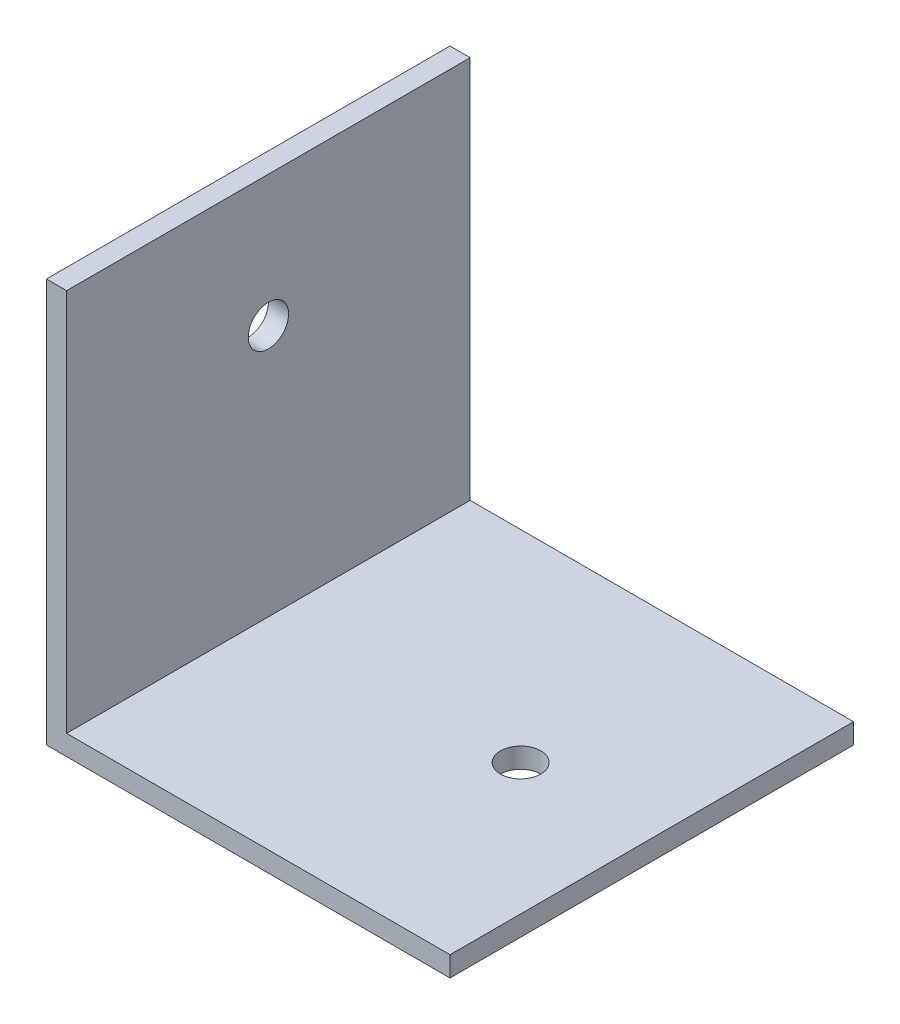
ISO-10303-21;
HEADER;
FILE_DESCRIPTION(('STEP AP214'),'2;1');
FILE_NAME('part.step','',(''),(''),'','','');
FILE_SCHEMA(('AUTOMOTIVE_DESIGN { 1 0 10303 214 1 1 1 1 }'));
ENDSEC;
DATA;
#1=APPLICATION_CONTEXT('core data for automotive mechanical design processes');
#2=APPLICATION_PROTOCOL_DEFINITION('international standard','automotive_design',2000,#1);
#3=PRODUCT_CONTEXT('',#1,'mechanical');
#4=PRODUCT('Part','Part','',(#3));
#5=PRODUCT_RELATED_PRODUCT_CATEGORY('part','',(#4));
#6=PRODUCT_DEFINITION_FORMATION('','',#4);
#7=PRODUCT_DEFINITION_CONTEXT('part definition',#1,'design');
#8=PRODUCT_DEFINITION('design','',#6,#7);
#9=PRODUCT_DEFINITION_SHAPE('','',#8);
#10=(LENGTH_UNIT() NAMED_UNIT(*) SI_UNIT(.MILLI.,.METRE.));
#11=(NAMED_UNIT(*) PLANE_ANGLE_UNIT() SI_UNIT($,.RADIAN.));
#12=(NAMED_UNIT(*) SI_UNIT($,.STERADIAN.) SOLID_ANGLE_UNIT());
#13=UNCERTAINTY_MEASURE_WITH_UNIT(LENGTH_MEASURE(1.E-05),#10,'distance_accuracy_value','');
#14=(GEOMETRIC_REPRESENTATION_CONTEXT(3) GLOBAL_UNCERTAINTY_ASSIGNED_CONTEXT((#13)) GLOBAL_UNIT_ASSIGNED_CONTEXT((#10,
#11,#12)) REPRESENTATION_CONTEXT('',''));
#15=CARTESIAN_POINT('',(0.,0.,0.));
#16=DIRECTION('',(0.,0.,1.));
#17=DIRECTION('',(1.,0.,0.));
#18=AXIS2_PLACEMENT_3D('',#15,#16,#17);
#19=CARTESIAN_POINT('',(1.,0.,20.));
#20=DIRECTION('',(-1.,0.,0.));
#21=DIRECTION('',(0.,0.,1.));
#22=AXIS2_PLACEMENT_3D('',#19,#20,#21);
#23=PLANE('',#22);
#24=CARTESIAN_POINT('',(1.,13.5,10.));
#25=DIRECTION('',(1.,0.,0.));
#26=DIRECTION('',(0.,0.,-1.));
#27=AXIS2_PLACEMENT_3D('',#24,#25,#26);
#28=CIRCLE('',#27,0.999999999999999);
#29=CARTESIAN_POINT('',(1.,13.5,9.));
#30=VERTEX_POINT('',#29);
#31=EDGE_CURVE('E160',#30,#30,#28,.T.);
#32=ORIENTED_EDGE('',*,*,#31,.F.);
#33=EDGE_LOOP('',(#32));
#34=FACE_BOUND('',#33,.T.);
#35=DIRECTION('',(0.,1.,0.));
#36=VECTOR('',#35,1.);
#37=CARTESIAN_POINT('',(1.,0.,0.));
#38=LINE('',#37,#36);
#39=CARTESIAN_POINT('',(1.,1.,0.));
#40=VERTEX_POINT('',#39);
#41=CARTESIAN_POINT('',(1.,20.,0.));
#42=VERTEX_POINT('',#41);
#43=EDGE_CURVE('E114',#40,#42,#38,.T.);
#44=ORIENTED_EDGE('',*,*,#43,.T.);
#45=DIRECTION('',(0.,0.,-1.));
#46=VECTOR('',#45,1.);
#47=CARTESIAN_POINT('',(1.,20.,20.));
#48=LINE('',#47,#46);
#49=CARTESIAN_POINT('',(1.,20.,20.));
#50=VERTEX_POINT('',#49);
#51=EDGE_CURVE('E11',#50,#42,#48,.T.);
#52=ORIENTED_EDGE('',*,*,#51,.F.);
#53=DIRECTION('',(0.,1.,0.));
#54=VECTOR('',#53,1.);
#55=CARTESIAN_POINT('',(1.,0.,20.));
#56=LINE('',#55,#54);
#57=CARTESIAN_POINT('',(1.,1.,20.));
#58=VERTEX_POINT('',#57);
#59=EDGE_CURVE('E79',#58,#50,#56,.T.);
#60=ORIENTED_EDGE('',*,*,#59,.F.);
#61=DIRECTION('',(0.,0.,-1.));
#62=VECTOR('',#61,1.);
#63=CARTESIAN_POINT('',(1.,1.,20.));
#64=LINE('',#63,#62);
#65=EDGE_CURVE('E110',#58,#40,#64,.T.);
#66=ORIENTED_EDGE('',*,*,#65,.T.);
#67=EDGE_LOOP('',(#44,#52,#60,#66));
#68=FACE_BOUND('',#67,.T.);
#69=ADVANCED_FACE('F33',(#34,#68),#23,.F.);
#70=CARTESIAN_POINT('',(0.,20.,20.));
#71=DIRECTION('',(0.,1.,0.));
#72=DIRECTION('',(0.,0.,1.));
#73=AXIS2_PLACEMENT_3D('',#70,#71,#72);
#74=PLANE('',#73);
#75=DIRECTION('',(1.,0.,0.));
#76=VECTOR('',#75,1.);
#77=CARTESIAN_POINT('',(0.,20.,0.));
#78=LINE('',#77,#76);
#79=CARTESIAN_POINT('',(0.,20.,0.));
#80=VERTEX_POINT('',#79);
#81=EDGE_CURVE('E117',#80,#42,#78,.T.);
#82=ORIENTED_EDGE('',*,*,#81,.F.);
#83=DIRECTION('',(0.,0.,-1.));
#84=VECTOR('',#83,1.);
#85=CARTESIAN_POINT('',(0.,20.,20.));
#86=LINE('',#85,#84);
#87=CARTESIAN_POINT('',(0.,20.,20.));
#88=VERTEX_POINT('',#87);
#89=EDGE_CURVE('E41',#88,#80,#86,.T.);
#90=ORIENTED_EDGE('',*,*,#89,.F.);
#91=DIRECTION('',(1.,0.,0.));
#92=VECTOR('',#91,1.);
#93=CARTESIAN_POINT('',(0.,20.,20.));
#94=LINE('',#93,#92);
#95=EDGE_CURVE('E172',#88,#50,#94,.T.);
#96=ORIENTED_EDGE('',*,*,#95,.T.);
#97=ORIENTED_EDGE('',*,*,#51,.T.);
#98=EDGE_LOOP('',(#82,#90,#96,#97));
#99=FACE_BOUND('',#98,.T.);
#100=ADVANCED_FACE('F136',(#99),#74,.T.);
#101=CARTESIAN_POINT('',(0.,0.,20.));
#102=DIRECTION('',(-1.,0.,0.));
#103=DIRECTION('',(0.,0.,1.));
#104=AXIS2_PLACEMENT_3D('',#101,#102,#103);
#105=PLANE('',#104);
#106=CARTESIAN_POINT('',(0.,13.5,10.));
#107=DIRECTION('',(1.,0.,0.));
#108=DIRECTION('',(0.,0.,-1.));
#109=AXIS2_PLACEMENT_3D('',#106,#107,#108);
#110=CIRCLE('',#109,0.999999999999999);
#111=CARTESIAN_POINT('',(0.,13.5,9.));
#112=VERTEX_POINT('',#111);
#113=EDGE_CURVE('E118',#112,#112,#110,.T.);
#114=ORIENTED_EDGE('',*,*,#113,.T.);
#115=EDGE_LOOP('',(#114));
#116=FACE_BOUND('',#115,.T.);
#117=DIRECTION('',(0.,1.,0.));
#118=VECTOR('',#117,1.);
#119=CARTESIAN_POINT('',(0.,0.,0.));
#120=LINE('',#119,#118);
#121=CARTESIAN_POINT('',(0.,0.,0.));
#122=VERTEX_POINT('',#121);
#123=EDGE_CURVE('E121',#122,#80,#120,.T.);
#124=ORIENTED_EDGE('',*,*,#123,.F.);
#125=DIRECTION('',(0.,0.,-1.));
#126=VECTOR('',#125,1.);
#127=CARTESIAN_POINT('',(0.,0.,20.));
#128=LINE('',#127,#126);
#129=CARTESIAN_POINT('',(0.,0.,20.));
#130=VERTEX_POINT('',#129);
#131=EDGE_CURVE('E100',#130,#122,#128,.T.);
#132=ORIENTED_EDGE('',*,*,#131,.F.);
#133=DIRECTION('',(0.,1.,0.));
#134=VECTOR('',#133,1.);
#135=CARTESIAN_POINT('',(0.,0.,20.));
#136=LINE('',#135,#134);
#137=EDGE_CURVE('E106',#130,#88,#136,.T.);
#138=ORIENTED_EDGE('',*,*,#137,.T.);
#139=ORIENTED_EDGE('',*,*,#89,.T.);
#140=EDGE_LOOP('',(#124,#132,#138,#139));
#141=FACE_BOUND('',#140,.T.);
#142=ADVANCED_FACE('F133',(#116,#141),#105,.T.);
#143=CARTESIAN_POINT('',(0.,0.,20.));
#144=DIRECTION('',(0.,-1.,0.));
#145=DIRECTION('',(0.,0.,-1.));
#146=AXIS2_PLACEMENT_3D('',#143,#144,#145);
#147=PLANE('',#146);
#148=CARTESIAN_POINT('',(13.5,0.,10.));
#149=DIRECTION('',(0.,1.,0.));
#150=DIRECTION('',(0.,0.,1.));
#151=AXIS2_PLACEMENT_3D('',#148,#149,#150);
#152=CIRCLE('',#151,1.);
#153=CARTESIAN_POINT('',(13.5,0.,11.));
#154=VERTEX_POINT('',#153);
#155=EDGE_CURVE('E162',#154,#154,#152,.T.);
#156=ORIENTED_EDGE('',*,*,#155,.T.);
#157=EDGE_LOOP('',(#156));
#158=FACE_BOUND('',#157,.T.);
#159=DIRECTION('',(-1.,0.,0.));
#160=VECTOR('',#159,1.);
#161=CARTESIAN_POINT('',(0.,0.,0.));
#162=LINE('',#161,#160);
#163=CARTESIAN_POINT('',(20.,0.,0.));
#164=VERTEX_POINT('',#163);
#165=EDGE_CURVE('E95',#164,#122,#162,.T.);
#166=ORIENTED_EDGE('',*,*,#165,.F.);
#167=DIRECTION('',(0.,0.,-1.));
#168=VECTOR('',#167,1.);
#169=CARTESIAN_POINT('',(20.,0.,20.));
#170=LINE('',#169,#168);
#171=CARTESIAN_POINT('',(20.,0.,20.));
#172=VERTEX_POINT('',#171);
#173=EDGE_CURVE('E90',#172,#164,#170,.T.);
#174=ORIENTED_EDGE('',*,*,#173,.F.);
#175=DIRECTION('',(-1.,0.,0.));
#176=VECTOR('',#175,1.);
#177=CARTESIAN_POINT('',(0.,0.,20.));
#178=LINE('',#177,#176);
#179=EDGE_CURVE('E93',#172,#130,#178,.T.);
#180=ORIENTED_EDGE('',*,*,#179,.T.);
#181=ORIENTED_EDGE('',*,*,#131,.T.);
#182=EDGE_LOOP('',(#166,#174,#180,#181));
#183=FACE_BOUND('',#182,.T.);
#184=ADVANCED_FACE('F92',(#158,#183),#147,.T.);
#185=CARTESIAN_POINT('',(20.,1.,20.));
#186=DIRECTION('',(1.,0.,0.));
#187=DIRECTION('',(0.,0.,-1.));
#188=AXIS2_PLACEMENT_3D('',#185,#186,#187);
#189=PLANE('',#188);
#190=DIRECTION('',(0.,-1.,0.));
#191=VECTOR('',#190,1.);
#192=CARTESIAN_POINT('',(20.,1.,0.));
#193=LINE('',#192,#191);
#194=CARTESIAN_POINT('',(20.,1.,0.));
#195=VERTEX_POINT('',#194);
#196=EDGE_CURVE('E125',#195,#164,#193,.T.);
#197=ORIENTED_EDGE('',*,*,#196,.F.);
#198=DIRECTION('',(0.,0.,-1.));
#199=VECTOR('',#198,1.);
#200=CARTESIAN_POINT('',(20.,1.,20.));
#201=LINE('',#200,#199);
#202=CARTESIAN_POINT('',(20.,1.,20.));
#203=VERTEX_POINT('',#202);
#204=EDGE_CURVE('E70',#203,#195,#201,.T.);
#205=ORIENTED_EDGE('',*,*,#204,.F.);
#206=DIRECTION('',(0.,-1.,0.));
#207=VECTOR('',#206,1.);
#208=CARTESIAN_POINT('',(20.,1.,20.));
#209=LINE('',#208,#207);
#210=EDGE_CURVE('E104',#203,#172,#209,.T.);
#211=ORIENTED_EDGE('',*,*,#210,.T.);
#212=ORIENTED_EDGE('',*,*,#173,.T.);
#213=EDGE_LOOP('',(#197,#205,#211,#212));
#214=FACE_BOUND('',#213,.T.);
#215=ADVANCED_FACE('F108',(#214),#189,.T.);
#216=CARTESIAN_POINT('',(0.,1.,20.));
#217=DIRECTION('',(0.,-1.,0.));
#218=DIRECTION('',(0.,0.,-1.));
#219=AXIS2_PLACEMENT_3D('',#216,#217,#218);
#220=PLANE('',#219);
#221=CARTESIAN_POINT('',(13.5,1.,10.));
#222=DIRECTION('',(0.,1.,0.));
#223=DIRECTION('',(0.,0.,1.));
#224=AXIS2_PLACEMENT_3D('',#221,#222,#223);
#225=CIRCLE('',#224,1.);
#226=CARTESIAN_POINT('',(13.5,1.,11.));
#227=VERTEX_POINT('',#226);
#228=EDGE_CURVE('E167',#227,#227,#225,.T.);
#229=ORIENTED_EDGE('',*,*,#228,.F.);
#230=EDGE_LOOP('',(#229));
#231=FACE_BOUND('',#230,.T.);
#232=DIRECTION('',(1.,0.,0.));
#233=VECTOR('',#232,1.);
#234=CARTESIAN_POINT('',(0.,1.,0.));
#235=LINE('',#234,#233);
#236=EDGE_CURVE('E73',#195,#40,#235,.F.);
#237=ORIENTED_EDGE('',*,*,#236,.T.);
#238=ORIENTED_EDGE('',*,*,#65,.F.);
#239=DIRECTION('',(1.,0.,0.));
#240=VECTOR('',#239,1.);
#241=CARTESIAN_POINT('',(0.,1.,20.));
#242=LINE('',#241,#240);
#243=EDGE_CURVE('E49',#203,#58,#242,.F.);
#244=ORIENTED_EDGE('',*,*,#243,.F.);
#245=ORIENTED_EDGE('',*,*,#204,.T.);
#246=EDGE_LOOP('',(#237,#238,#244,#245));
#247=FACE_BOUND('',#246,.T.);
#248=ADVANCED_FACE('F141',(#231,#247),#220,.F.);
#249=CARTESIAN_POINT('',(0.,0.,20.));
#250=DIRECTION('',(0.,0.,-1.));
#251=DIRECTION('',(-1.,0.,0.));
#252=AXIS2_PLACEMENT_3D('',#249,#250,#251);
#253=PLANE('',#252);
#254=ORIENTED_EDGE('',*,*,#59,.T.);
#255=ORIENTED_EDGE('',*,*,#95,.F.);
#256=ORIENTED_EDGE('',*,*,#137,.F.);
#257=ORIENTED_EDGE('',*,*,#179,.F.);
#258=ORIENTED_EDGE('',*,*,#210,.F.);
#259=ORIENTED_EDGE('',*,*,#243,.T.);
#260=EDGE_LOOP('',(#254,#255,#256,#257,#258,#259));
#261=FACE_BOUND('',#260,.T.);
#262=ADVANCED_FACE('F103',(#261),#253,.F.);
#263=CARTESIAN_POINT('',(0.,0.,0.));
#264=DIRECTION('',(0.,0.,-1.));
#265=DIRECTION('',(-1.,0.,0.));
#266=AXIS2_PLACEMENT_3D('',#263,#264,#265);
#267=PLANE('',#266);
#268=ORIENTED_EDGE('',*,*,#43,.F.);
#269=ORIENTED_EDGE('',*,*,#236,.F.);
#270=ORIENTED_EDGE('',*,*,#196,.T.);
#271=ORIENTED_EDGE('',*,*,#165,.T.);
#272=ORIENTED_EDGE('',*,*,#123,.T.);
#273=ORIENTED_EDGE('',*,*,#81,.T.);
#274=EDGE_LOOP('',(#268,#269,#270,#271,#272,#273));
#275=FACE_BOUND('',#274,.T.);
#276=ADVANCED_FACE('F139',(#275),#267,.T.);
#277=CARTESIAN_POINT('',(0.,13.5,10.));
#278=DIRECTION('',(1.,0.,0.));
#279=DIRECTION('',(0.,0.,-1.));
#280=AXIS2_PLACEMENT_3D('',#277,#278,#279);
#281=CYLINDRICAL_SURFACE('',#280,0.999999999999999);
#282=ORIENTED_EDGE('',*,*,#113,.F.);
#283=EDGE_LOOP('',(#282));
#284=FACE_BOUND('',#283,.T.);
#285=ORIENTED_EDGE('',*,*,#31,.T.);
#286=EDGE_LOOP('',(#285));
#287=FACE_BOUND('',#286,.T.);
#288=ADVANCED_FACE('F177',(#284,#287),#281,.F.);
#289=CARTESIAN_POINT('',(13.5,0.,10.));
#290=DIRECTION('',(0.,1.,0.));
#291=DIRECTION('',(0.,0.,1.));
#292=AXIS2_PLACEMENT_3D('',#289,#290,#291);
#293=CYLINDRICAL_SURFACE('',#292,1.);
#294=ORIENTED_EDGE('',*,*,#155,.F.);
#295=EDGE_LOOP('',(#294));
#296=FACE_BOUND('',#295,.T.);
#297=ORIENTED_EDGE('',*,*,#228,.T.);
#298=EDGE_LOOP('',(#297));
#299=FACE_BOUND('',#298,.T.);
#300=ADVANCED_FACE('F175',(#296,#299),#293,.F.);
#301=CLOSED_SHELL('',(#69,#100,#142,#184,#215,#248,#262,#276,#288,#300));
#302=MANIFOLD_SOLID_BREP('B2',#301);
#303=ADVANCED_BREP_SHAPE_REPRESENTATION('',(#18,#302),#14);
#304=SHAPE_DEFINITION_REPRESENTATION(#9,#303);
ENDSEC;
END-ISO-10303-21;
